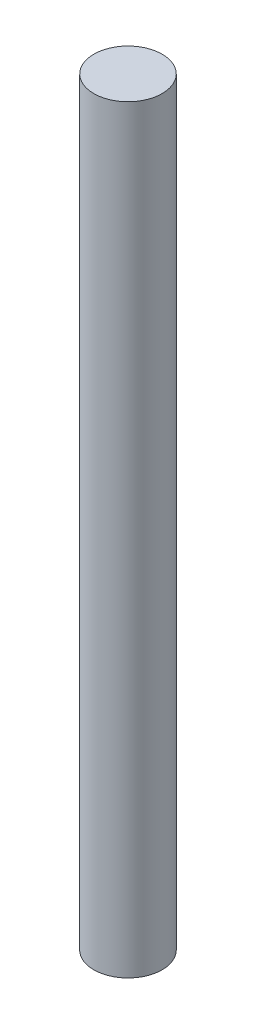
ISO-10303-21;
HEADER;
FILE_DESCRIPTION(('STEP AP214'),'2;1');
FILE_NAME('part.step','',(''),(''),'','','');
FILE_SCHEMA(('AUTOMOTIVE_DESIGN { 1 0 10303 214 1 1 1 1 }'));
ENDSEC;
DATA;
#1=APPLICATION_CONTEXT('core data for automotive mechanical design processes');
#2=APPLICATION_PROTOCOL_DEFINITION('international standard','automotive_design',2000,#1);
#3=PRODUCT_CONTEXT('',#1,'mechanical');
#4=PRODUCT('Part','Part','',(#3));
#5=PRODUCT_RELATED_PRODUCT_CATEGORY('part','',(#4));
#6=PRODUCT_DEFINITION_FORMATION('','',#4);
#7=PRODUCT_DEFINITION_CONTEXT('part definition',#1,'design');
#8=PRODUCT_DEFINITION('design','',#6,#7);
#9=PRODUCT_DEFINITION_SHAPE('','',#8);
#10=(LENGTH_UNIT() NAMED_UNIT(*) SI_UNIT(.MILLI.,.METRE.));
#11=(NAMED_UNIT(*) PLANE_ANGLE_UNIT() SI_UNIT($,.RADIAN.));
#12=(NAMED_UNIT(*) SI_UNIT($,.STERADIAN.) SOLID_ANGLE_UNIT());
#13=UNCERTAINTY_MEASURE_WITH_UNIT(LENGTH_MEASURE(1.E-05),#10,'distance_accuracy_value','');
#14=(GEOMETRIC_REPRESENTATION_CONTEXT(3) GLOBAL_UNCERTAINTY_ASSIGNED_CONTEXT((#13)) GLOBAL_UNIT_ASSIGNED_CONTEXT((#10,
#11,#12)) REPRESENTATION_CONTEXT('',''));
#15=CARTESIAN_POINT('',(0.,0.,0.));
#16=DIRECTION('',(0.,0.,1.));
#17=DIRECTION('',(1.,0.,0.));
#18=AXIS2_PLACEMENT_3D('',#15,#16,#17);
#19=CARTESIAN_POINT('',(0.,100.,0.));
#20=DIRECTION('',(0.,-1.,0.));
#21=DIRECTION('',(0.,0.,-1.));
#22=AXIS2_PLACEMENT_3D('',#19,#20,#21);
#23=CYLINDRICAL_SURFACE('',#22,4.5);
#24=CARTESIAN_POINT('',(0.,100.,0.));
#25=DIRECTION('',(0.,1.,0.));
#26=DIRECTION('',(0.,0.,1.));
#27=AXIS2_PLACEMENT_3D('',#24,#25,#26);
#28=CIRCLE('',#27,4.5);
#29=CARTESIAN_POINT('',(0.,100.,4.5));
#30=VERTEX_POINT('',#29);
#31=EDGE_CURVE('E10',#30,#30,#28,.T.);
#32=ORIENTED_EDGE('',*,*,#31,.F.);
#33=EDGE_LOOP('',(#32));
#34=FACE_BOUND('',#33,.T.);
#35=CARTESIAN_POINT('',(0.,0.,0.));
#36=DIRECTION('',(0.,1.,0.));
#37=DIRECTION('',(0.,0.,1.));
#38=AXIS2_PLACEMENT_3D('',#35,#36,#37);
#39=CIRCLE('',#38,4.5);
#40=CARTESIAN_POINT('',(0.,0.,4.5));
#41=VERTEX_POINT('',#40);
#42=EDGE_CURVE('E46',#41,#41,#39,.T.);
#43=ORIENTED_EDGE('',*,*,#42,.T.);
#44=EDGE_LOOP('',(#43));
#45=FACE_BOUND('',#44,.T.);
#46=ADVANCED_FACE('F43',(#34,#45),#23,.T.);
#47=CARTESIAN_POINT('',(0.,100.,0.));
#48=DIRECTION('',(0.,1.,0.));
#49=DIRECTION('',(0.,0.,1.));
#50=AXIS2_PLACEMENT_3D('',#47,#48,#49);
#51=PLANE('',#50);
#52=ORIENTED_EDGE('',*,*,#31,.T.);
#53=EDGE_LOOP('',(#52));
#54=FACE_BOUND('',#53,.T.);
#55=ADVANCED_FACE('F60',(#54),#51,.T.);
#56=CARTESIAN_POINT('',(0.,0.,0.));
#57=DIRECTION('',(0.,1.,0.));
#58=DIRECTION('',(0.,0.,1.));
#59=AXIS2_PLACEMENT_3D('',#56,#57,#58);
#60=PLANE('',#59);
#61=ORIENTED_EDGE('',*,*,#42,.F.);
#62=EDGE_LOOP('',(#61));
#63=FACE_BOUND('',#62,.T.);
#64=ADVANCED_FACE('F58',(#63),#60,.F.);
#65=CLOSED_SHELL('',(#46,#55,#64));
#66=MANIFOLD_SOLID_BREP('B2',#65);
#67=ADVANCED_BREP_SHAPE_REPRESENTATION('',(#18,#66),#14);
#68=SHAPE_DEFINITION_REPRESENTATION(#9,#67);
ENDSEC;
END-ISO-10303-21;
